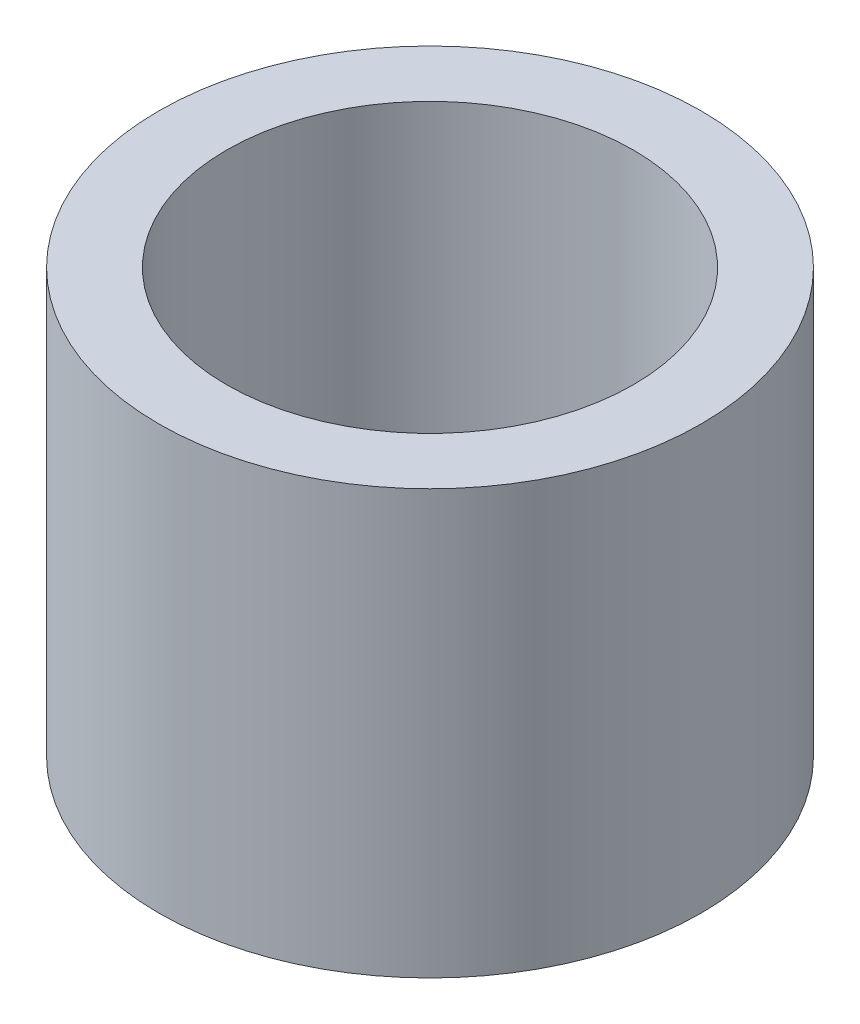
ISO-10303-21;
HEADER;
FILE_DESCRIPTION(('STEP AP214'),'2;1');
FILE_NAME('part.step','',(''),(''),'','','');
FILE_SCHEMA(('AUTOMOTIVE_DESIGN { 1 0 10303 214 1 1 1 1 }'));
ENDSEC;
DATA;
#1=APPLICATION_CONTEXT('core data for automotive mechanical design processes');
#2=APPLICATION_PROTOCOL_DEFINITION('international standard','automotive_design',2000,#1);
#3=PRODUCT_CONTEXT('',#1,'mechanical');
#4=PRODUCT('Part','Part','',(#3));
#5=PRODUCT_RELATED_PRODUCT_CATEGORY('part','',(#4));
#6=PRODUCT_DEFINITION_FORMATION('','',#4);
#7=PRODUCT_DEFINITION_CONTEXT('part definition',#1,'design');
#8=PRODUCT_DEFINITION('design','',#6,#7);
#9=PRODUCT_DEFINITION_SHAPE('','',#8);
#10=(LENGTH_UNIT() NAMED_UNIT(*) SI_UNIT(.MILLI.,.METRE.));
#11=(NAMED_UNIT(*) PLANE_ANGLE_UNIT() SI_UNIT($,.RADIAN.));
#12=(NAMED_UNIT(*) SI_UNIT($,.STERADIAN.) SOLID_ANGLE_UNIT());
#13=UNCERTAINTY_MEASURE_WITH_UNIT(LENGTH_MEASURE(1.E-05),#10,'distance_accuracy_value','');
#14=(GEOMETRIC_REPRESENTATION_CONTEXT(3) GLOBAL_UNCERTAINTY_ASSIGNED_CONTEXT((#13)) GLOBAL_UNIT_ASSIGNED_CONTEXT((#10,
#11,#12)) REPRESENTATION_CONTEXT('',''));
#15=CARTESIAN_POINT('',(0.,0.,0.));
#16=DIRECTION('',(0.,0.,1.));
#17=DIRECTION('',(1.,0.,0.));
#18=AXIS2_PLACEMENT_3D('',#15,#16,#17);
#19=CARTESIAN_POINT('',(0.,25.,0.));
#20=DIRECTION('',(0.,1.,0.));
#21=DIRECTION('',(0.,0.,1.));
#22=AXIS2_PLACEMENT_3D('',#19,#20,#21);
#23=PLANE('',#22);
#24=CARTESIAN_POINT('',(0.,25.,0.));
#25=DIRECTION('',(0.,1.,0.));
#26=DIRECTION('',(0.,0.,1.));
#27=AXIS2_PLACEMENT_3D('',#24,#25,#26);
#28=CIRCLE('',#27,16.);
#29=CARTESIAN_POINT('',(0.,25.,16.));
#30=VERTEX_POINT('',#29);
#31=EDGE_CURVE('E12',#30,#30,#28,.T.);
#32=ORIENTED_EDGE('',*,*,#31,.T.);
#33=EDGE_LOOP('',(#32));
#34=FACE_BOUND('',#33,.T.);
#35=CARTESIAN_POINT('',(0.,25.,0.));
#36=DIRECTION('',(0.,1.,0.));
#37=DIRECTION('',(0.,0.,1.));
#38=AXIS2_PLACEMENT_3D('',#35,#36,#37);
#39=CIRCLE('',#38,12.);
#40=CARTESIAN_POINT('',(0.,25.,12.));
#41=VERTEX_POINT('',#40);
#42=EDGE_CURVE('E55',#41,#41,#39,.T.);
#43=ORIENTED_EDGE('',*,*,#42,.F.);
#44=EDGE_LOOP('',(#43));
#45=FACE_BOUND('',#44,.T.);
#46=ADVANCED_FACE('F44',(#34,#45),#23,.T.);
#47=CARTESIAN_POINT('',(0.,0.,0.));
#48=DIRECTION('',(0.,1.,0.));
#49=DIRECTION('',(0.,0.,1.));
#50=AXIS2_PLACEMENT_3D('',#47,#48,#49);
#51=PLANE('',#50);
#52=CARTESIAN_POINT('',(0.,0.,0.));
#53=DIRECTION('',(0.,1.,0.));
#54=DIRECTION('',(0.,0.,1.));
#55=AXIS2_PLACEMENT_3D('',#52,#53,#54);
#56=CIRCLE('',#55,16.);
#57=CARTESIAN_POINT('',(0.,0.,16.));
#58=VERTEX_POINT('',#57);
#59=EDGE_CURVE('E48',#58,#58,#56,.T.);
#60=ORIENTED_EDGE('',*,*,#59,.F.);
#61=EDGE_LOOP('',(#60));
#62=FACE_BOUND('',#61,.T.);
#63=CARTESIAN_POINT('',(0.,0.,0.));
#64=DIRECTION('',(0.,1.,0.));
#65=DIRECTION('',(0.,0.,1.));
#66=AXIS2_PLACEMENT_3D('',#63,#64,#65);
#67=CIRCLE('',#66,12.);
#68=CARTESIAN_POINT('',(0.,0.,12.));
#69=VERTEX_POINT('',#68);
#70=EDGE_CURVE('E57',#69,#69,#67,.T.);
#71=ORIENTED_EDGE('',*,*,#70,.T.);
#72=EDGE_LOOP('',(#71));
#73=FACE_BOUND('',#72,.T.);
#74=ADVANCED_FACE('F67',(#62,#73),#51,.F.);
#75=CARTESIAN_POINT('',(0.,25.,0.));
#76=DIRECTION('',(0.,-1.,0.));
#77=DIRECTION('',(0.,0.,-1.));
#78=AXIS2_PLACEMENT_3D('',#75,#76,#77);
#79=CYLINDRICAL_SURFACE('',#78,16.);
#80=ORIENTED_EDGE('',*,*,#31,.F.);
#81=EDGE_LOOP('',(#80));
#82=FACE_BOUND('',#81,.T.);
#83=ORIENTED_EDGE('',*,*,#59,.T.);
#84=EDGE_LOOP('',(#83));
#85=FACE_BOUND('',#84,.T.);
#86=ADVANCED_FACE('F46',(#82,#85),#79,.T.);
#87=CARTESIAN_POINT('',(0.,25.,0.));
#88=DIRECTION('',(0.,-1.,0.));
#89=DIRECTION('',(0.,0.,-1.));
#90=AXIS2_PLACEMENT_3D('',#87,#88,#89);
#91=CYLINDRICAL_SURFACE('',#90,12.);
#92=ORIENTED_EDGE('',*,*,#42,.T.);
#93=EDGE_LOOP('',(#92));
#94=FACE_BOUND('',#93,.T.);
#95=ORIENTED_EDGE('',*,*,#70,.F.);
#96=EDGE_LOOP('',(#95));
#97=FACE_BOUND('',#96,.T.);
#98=ADVANCED_FACE('F63',(#94,#97),#91,.F.);
#99=CLOSED_SHELL('',(#46,#74,#86,#98));
#100=MANIFOLD_SOLID_BREP('B2',#99);
#101=ADVANCED_BREP_SHAPE_REPRESENTATION('',(#18,#100),#14);
#102=SHAPE_DEFINITION_REPRESENTATION(#9,#101);
ENDSEC;
END-ISO-10303-21;
